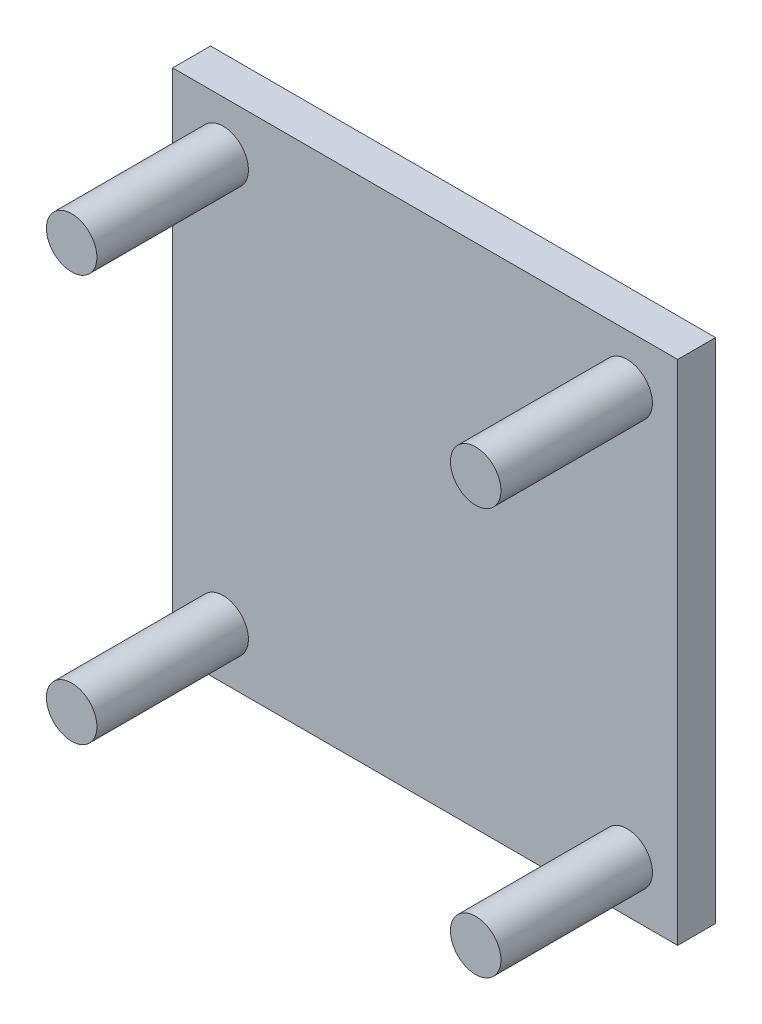
ISO-10303-21;
HEADER;
FILE_DESCRIPTION(('STEP AP214'),'2;1');
FILE_NAME('part.step','',(''),(''),'','','');
FILE_SCHEMA(('AUTOMOTIVE_DESIGN { 1 0 10303 214 1 1 1 1 }'));
ENDSEC;
DATA;
#1=APPLICATION_CONTEXT('core data for automotive mechanical design processes');
#2=APPLICATION_PROTOCOL_DEFINITION('international standard','automotive_design',2000,#1);
#3=PRODUCT_CONTEXT('',#1,'mechanical');
#4=PRODUCT('Part','Part','',(#3));
#5=PRODUCT_RELATED_PRODUCT_CATEGORY('part','',(#4));
#6=PRODUCT_DEFINITION_FORMATION('','',#4);
#7=PRODUCT_DEFINITION_CONTEXT('part definition',#1,'design');
#8=PRODUCT_DEFINITION('design','',#6,#7);
#9=PRODUCT_DEFINITION_SHAPE('','',#8);
#10=(LENGTH_UNIT() NAMED_UNIT(*) SI_UNIT(.MILLI.,.METRE.));
#11=(NAMED_UNIT(*) PLANE_ANGLE_UNIT() SI_UNIT($,.RADIAN.));
#12=(NAMED_UNIT(*) SI_UNIT($,.STERADIAN.) SOLID_ANGLE_UNIT());
#13=UNCERTAINTY_MEASURE_WITH_UNIT(LENGTH_MEASURE(1.E-05),#10,'distance_accuracy_value','');
#14=(GEOMETRIC_REPRESENTATION_CONTEXT(3) GLOBAL_UNCERTAINTY_ASSIGNED_CONTEXT((#13)) GLOBAL_UNIT_ASSIGNED_CONTEXT((#10,
#11,#12)) REPRESENTATION_CONTEXT('',''));
#15=CARTESIAN_POINT('',(0.,0.,0.));
#16=DIRECTION('',(0.,0.,1.));
#17=DIRECTION('',(1.,0.,0.));
#18=AXIS2_PLACEMENT_3D('',#15,#16,#17);
#19=CARTESIAN_POINT('',(-20.,20.0966993778737,3.));
#20=DIRECTION('',(1.,0.,0.));
#21=DIRECTION('',(0.,0.,-1.));
#22=AXIS2_PLACEMENT_3D('',#19,#20,#21);
#23=PLANE('',#22);
#24=DIRECTION('',(0.,-1.,0.));
#25=VECTOR('',#24,1.);
#26=CARTESIAN_POINT('',(-20.,20.0966993778737,0.));
#27=LINE('',#26,#25);
#28=CARTESIAN_POINT('',(-20.,20.0966993778737,0.));
#29=VERTEX_POINT('',#28);
#30=CARTESIAN_POINT('',(-20.,-20.0966993778737,0.));
#31=VERTEX_POINT('',#30);
#32=EDGE_CURVE('E100',#29,#31,#27,.T.);
#33=ORIENTED_EDGE('',*,*,#32,.T.);
#34=DIRECTION('',(0.,0.,-1.));
#35=VECTOR('',#34,1.);
#36=CARTESIAN_POINT('',(-20.,-20.0966993778737,3.));
#37=LINE('',#36,#35);
#38=CARTESIAN_POINT('',(-20.,-20.0966993778737,3.));
#39=VERTEX_POINT('',#38);
#40=EDGE_CURVE('E11',#39,#31,#37,.T.);
#41=ORIENTED_EDGE('',*,*,#40,.F.);
#42=DIRECTION('',(0.,-1.,0.));
#43=VECTOR('',#42,1.);
#44=CARTESIAN_POINT('',(-20.,20.0966993778737,3.));
#45=LINE('',#44,#43);
#46=CARTESIAN_POINT('',(-20.,20.0966993778737,3.));
#47=VERTEX_POINT('',#46);
#48=EDGE_CURVE('E88',#47,#39,#45,.T.);
#49=ORIENTED_EDGE('',*,*,#48,.F.);
#50=DIRECTION('',(0.,0.,-1.));
#51=VECTOR('',#50,1.);
#52=CARTESIAN_POINT('',(-20.,20.0966993778737,3.));
#53=LINE('',#52,#51);
#54=EDGE_CURVE('E96',#47,#29,#53,.T.);
#55=ORIENTED_EDGE('',*,*,#54,.T.);
#56=EDGE_LOOP('',(#33,#41,#49,#55));
#57=FACE_BOUND('',#56,.T.);
#58=ADVANCED_FACE('F37',(#57),#23,.F.);
#59=CARTESIAN_POINT('',(-20.,-20.0966993778737,3.));
#60=DIRECTION('',(0.,1.,0.));
#61=DIRECTION('',(0.,0.,1.));
#62=AXIS2_PLACEMENT_3D('',#59,#60,#61);
#63=PLANE('',#62);
#64=DIRECTION('',(1.,0.,0.));
#65=VECTOR('',#64,1.);
#66=CARTESIAN_POINT('',(-20.,-20.0966993778737,0.));
#67=LINE('',#66,#65);
#68=CARTESIAN_POINT('',(20.,-20.0966993778737,0.));
#69=VERTEX_POINT('',#68);
#70=EDGE_CURVE('E92',#31,#69,#67,.T.);
#71=ORIENTED_EDGE('',*,*,#70,.T.);
#72=DIRECTION('',(0.,0.,-1.));
#73=VECTOR('',#72,1.);
#74=CARTESIAN_POINT('',(20.,-20.0966993778737,3.));
#75=LINE('',#74,#73);
#76=CARTESIAN_POINT('',(20.,-20.0966993778737,3.));
#77=VERTEX_POINT('',#76);
#78=EDGE_CURVE('E45',#77,#69,#75,.T.);
#79=ORIENTED_EDGE('',*,*,#78,.F.);
#80=DIRECTION('',(1.,0.,0.));
#81=VECTOR('',#80,1.);
#82=CARTESIAN_POINT('',(-20.,-20.0966993778737,3.));
#83=LINE('',#82,#81);
#84=EDGE_CURVE('E83',#39,#77,#83,.T.);
#85=ORIENTED_EDGE('',*,*,#84,.F.);
#86=ORIENTED_EDGE('',*,*,#40,.T.);
#87=EDGE_LOOP('',(#71,#79,#85,#86));
#88=FACE_BOUND('',#87,.T.);
#89=ADVANCED_FACE('F91',(#88),#63,.F.);
#90=CARTESIAN_POINT('',(20.,-20.0966993778737,3.));
#91=DIRECTION('',(-1.,0.,0.));
#92=DIRECTION('',(0.,0.,1.));
#93=AXIS2_PLACEMENT_3D('',#90,#91,#92);
#94=PLANE('',#93);
#95=DIRECTION('',(0.,1.,0.));
#96=VECTOR('',#95,1.);
#97=CARTESIAN_POINT('',(20.,-20.0966993778737,0.));
#98=LINE('',#97,#96);
#99=CARTESIAN_POINT('',(20.,20.0966993778737,0.));
#100=VERTEX_POINT('',#99);
#101=EDGE_CURVE('E70',#69,#100,#98,.T.);
#102=ORIENTED_EDGE('',*,*,#101,.T.);
#103=DIRECTION('',(0.,0.,-1.));
#104=VECTOR('',#103,1.);
#105=CARTESIAN_POINT('',(20.,20.0966993778737,3.));
#106=LINE('',#105,#104);
#107=CARTESIAN_POINT('',(20.,20.0966993778737,3.));
#108=VERTEX_POINT('',#107);
#109=EDGE_CURVE('E93',#108,#100,#106,.T.);
#110=ORIENTED_EDGE('',*,*,#109,.F.);
#111=DIRECTION('',(0.,1.,0.));
#112=VECTOR('',#111,1.);
#113=CARTESIAN_POINT('',(20.,-20.0966993778737,3.));
#114=LINE('',#113,#112);
#115=EDGE_CURVE('E86',#77,#108,#114,.T.);
#116=ORIENTED_EDGE('',*,*,#115,.F.);
#117=ORIENTED_EDGE('',*,*,#78,.T.);
#118=EDGE_LOOP('',(#102,#110,#116,#117));
#119=FACE_BOUND('',#118,.T.);
#120=ADVANCED_FACE('F94',(#119),#94,.F.);
#121=CARTESIAN_POINT('',(20.,20.0966993778737,3.));
#122=DIRECTION('',(0.,-1.,0.));
#123=DIRECTION('',(0.,0.,-1.));
#124=AXIS2_PLACEMENT_3D('',#121,#122,#123);
#125=PLANE('',#124);
#126=DIRECTION('',(-1.,0.,0.));
#127=VECTOR('',#126,1.);
#128=CARTESIAN_POINT('',(20.,20.0966993778737,0.));
#129=LINE('',#128,#127);
#130=EDGE_CURVE('E76',#100,#29,#129,.T.);
#131=ORIENTED_EDGE('',*,*,#130,.T.);
#132=ORIENTED_EDGE('',*,*,#54,.F.);
#133=DIRECTION('',(-1.,0.,0.));
#134=VECTOR('',#133,1.);
#135=CARTESIAN_POINT('',(20.,20.0966993778737,3.));
#136=LINE('',#135,#134);
#137=EDGE_CURVE('E53',#108,#47,#136,.T.);
#138=ORIENTED_EDGE('',*,*,#137,.F.);
#139=ORIENTED_EDGE('',*,*,#109,.T.);
#140=EDGE_LOOP('',(#131,#132,#138,#139));
#141=FACE_BOUND('',#140,.T.);
#142=ADVANCED_FACE('F108',(#141),#125,.F.);
#143=CARTESIAN_POINT('',(0.,0.,3.));
#144=DIRECTION('',(0.,0.,1.));
#145=DIRECTION('',(1.,0.,0.));
#146=AXIS2_PLACEMENT_3D('',#143,#144,#145);
#147=PLANE('',#146);
#148=CARTESIAN_POINT('',(16.,16.0966993778737,3.));
#149=DIRECTION('',(0.,0.,1.));
#150=DIRECTION('',(1.,0.,0.));
#151=AXIS2_PLACEMENT_3D('',#148,#149,#150);
#152=CIRCLE('',#151,2.);
#153=CARTESIAN_POINT('',(18.,16.0966993778737,3.));
#154=VERTEX_POINT('',#153);
#155=EDGE_CURVE('E132',#154,#154,#152,.T.);
#156=ORIENTED_EDGE('',*,*,#155,.F.);
#157=EDGE_LOOP('',(#156));
#158=FACE_BOUND('',#157,.T.);
#159=CARTESIAN_POINT('',(16.,-16.0966993778737,3.));
#160=DIRECTION('',(0.,0.,1.));
#161=DIRECTION('',(1.,0.,0.));
#162=AXIS2_PLACEMENT_3D('',#159,#160,#161);
#163=CIRCLE('',#162,2.);
#164=CARTESIAN_POINT('',(18.,-16.0966993778737,3.));
#165=VERTEX_POINT('',#164);
#166=EDGE_CURVE('E126',#165,#165,#163,.T.);
#167=ORIENTED_EDGE('',*,*,#166,.F.);
#168=EDGE_LOOP('',(#167));
#169=FACE_BOUND('',#168,.T.);
#170=CARTESIAN_POINT('',(-16.,16.0966993778737,3.));
#171=DIRECTION('',(0.,0.,1.));
#172=DIRECTION('',(1.,0.,0.));
#173=AXIS2_PLACEMENT_3D('',#170,#171,#172);
#174=CIRCLE('',#173,2.);
#175=CARTESIAN_POINT('',(-14.,16.0966993778737,3.));
#176=VERTEX_POINT('',#175);
#177=EDGE_CURVE('E120',#176,#176,#174,.T.);
#178=ORIENTED_EDGE('',*,*,#177,.F.);
#179=EDGE_LOOP('',(#178));
#180=FACE_BOUND('',#179,.T.);
#181=CARTESIAN_POINT('',(-16.,-16.0966993778737,3.));
#182=DIRECTION('',(0.,0.,1.));
#183=DIRECTION('',(1.,0.,0.));
#184=AXIS2_PLACEMENT_3D('',#181,#182,#183);
#185=CIRCLE('',#184,2.);
#186=CARTESIAN_POINT('',(-14.,-16.0966993778737,3.));
#187=VERTEX_POINT('',#186);
#188=EDGE_CURVE('E114',#187,#187,#185,.T.);
#189=ORIENTED_EDGE('',*,*,#188,.F.);
#190=EDGE_LOOP('',(#189));
#191=FACE_BOUND('',#190,.T.);
#192=ORIENTED_EDGE('',*,*,#48,.T.);
#193=ORIENTED_EDGE('',*,*,#84,.T.);
#194=ORIENTED_EDGE('',*,*,#115,.T.);
#195=ORIENTED_EDGE('',*,*,#137,.T.);
#196=EDGE_LOOP('',(#192,#193,#194,#195));
#197=FACE_BOUND('',#196,.T.);
#198=ADVANCED_FACE('F84',(#158,#169,#180,#191,#197),#147,.T.);
#199=CARTESIAN_POINT('',(0.,0.,0.));
#200=DIRECTION('',(0.,0.,1.));
#201=DIRECTION('',(1.,0.,0.));
#202=AXIS2_PLACEMENT_3D('',#199,#200,#201);
#203=PLANE('',#202);
#204=ORIENTED_EDGE('',*,*,#32,.F.);
#205=ORIENTED_EDGE('',*,*,#130,.F.);
#206=ORIENTED_EDGE('',*,*,#101,.F.);
#207=ORIENTED_EDGE('',*,*,#70,.F.);
#208=EDGE_LOOP('',(#204,#205,#206,#207));
#209=FACE_BOUND('',#208,.T.);
#210=ADVANCED_FACE('F111',(#209),#203,.F.);
#211=CARTESIAN_POINT('',(-16.,-16.0966993778737,15.));
#212=DIRECTION('',(0.,0.,-1.));
#213=DIRECTION('',(-1.,0.,0.));
#214=AXIS2_PLACEMENT_3D('',#211,#212,#213);
#215=CYLINDRICAL_SURFACE('',#214,2.);
#216=CARTESIAN_POINT('',(-16.,-16.0966993778737,15.));
#217=DIRECTION('',(0.,0.,1.));
#218=DIRECTION('',(1.,0.,0.));
#219=AXIS2_PLACEMENT_3D('',#216,#217,#218);
#220=CIRCLE('',#219,2.);
#221=CARTESIAN_POINT('',(-14.,-16.0966993778737,15.));
#222=VERTEX_POINT('',#221);
#223=EDGE_CURVE('E103',#222,#222,#220,.T.);
#224=ORIENTED_EDGE('',*,*,#223,.F.);
#225=EDGE_LOOP('',(#224));
#226=FACE_BOUND('',#225,.T.);
#227=ORIENTED_EDGE('',*,*,#188,.T.);
#228=EDGE_LOOP('',(#227));
#229=FACE_BOUND('',#228,.T.);
#230=ADVANCED_FACE('F156',(#226,#229),#215,.T.);
#231=CARTESIAN_POINT('',(-16.,-16.0966993778737,15.));
#232=DIRECTION('',(0.,0.,1.));
#233=DIRECTION('',(1.,0.,0.));
#234=AXIS2_PLACEMENT_3D('',#231,#232,#233);
#235=PLANE('',#234);
#236=ORIENTED_EDGE('',*,*,#223,.T.);
#237=EDGE_LOOP('',(#236));
#238=FACE_BOUND('',#237,.T.);
#239=ADVANCED_FACE('F158',(#238),#235,.T.);
#240=CARTESIAN_POINT('',(-16.,16.0966993778737,15.));
#241=DIRECTION('',(0.,0.,-1.));
#242=DIRECTION('',(-1.,0.,0.));
#243=AXIS2_PLACEMENT_3D('',#240,#241,#242);
#244=CYLINDRICAL_SURFACE('',#243,2.);
#245=CARTESIAN_POINT('',(-16.,16.0966993778737,15.));
#246=DIRECTION('',(0.,0.,1.));
#247=DIRECTION('',(1.,0.,0.));
#248=AXIS2_PLACEMENT_3D('',#245,#246,#247);
#249=CIRCLE('',#248,2.);
#250=CARTESIAN_POINT('',(-14.,16.0966993778737,15.));
#251=VERTEX_POINT('',#250);
#252=EDGE_CURVE('E117',#251,#251,#249,.T.);
#253=ORIENTED_EDGE('',*,*,#252,.F.);
#254=EDGE_LOOP('',(#253));
#255=FACE_BOUND('',#254,.T.);
#256=ORIENTED_EDGE('',*,*,#177,.T.);
#257=EDGE_LOOP('',(#256));
#258=FACE_BOUND('',#257,.T.);
#259=ADVANCED_FACE('F165',(#255,#258),#244,.T.);
#260=CARTESIAN_POINT('',(-16.,16.0966993778737,15.));
#261=DIRECTION('',(0.,0.,1.));
#262=DIRECTION('',(1.,0.,0.));
#263=AXIS2_PLACEMENT_3D('',#260,#261,#262);
#264=PLANE('',#263);
#265=ORIENTED_EDGE('',*,*,#252,.T.);
#266=EDGE_LOOP('',(#265));
#267=FACE_BOUND('',#266,.T.);
#268=ADVANCED_FACE('F213',(#267),#264,.T.);
#269=CARTESIAN_POINT('',(16.,-16.0966993778737,15.));
#270=DIRECTION('',(0.,0.,-1.));
#271=DIRECTION('',(-1.,0.,0.));
#272=AXIS2_PLACEMENT_3D('',#269,#270,#271);
#273=CYLINDRICAL_SURFACE('',#272,2.);
#274=CARTESIAN_POINT('',(16.,-16.0966993778737,15.));
#275=DIRECTION('',(0.,0.,1.));
#276=DIRECTION('',(1.,0.,0.));
#277=AXIS2_PLACEMENT_3D('',#274,#275,#276);
#278=CIRCLE('',#277,2.);
#279=CARTESIAN_POINT('',(18.,-16.0966993778737,15.));
#280=VERTEX_POINT('',#279);
#281=EDGE_CURVE('E123',#280,#280,#278,.T.);
#282=ORIENTED_EDGE('',*,*,#281,.F.);
#283=EDGE_LOOP('',(#282));
#284=FACE_BOUND('',#283,.T.);
#285=ORIENTED_EDGE('',*,*,#166,.T.);
#286=EDGE_LOOP('',(#285));
#287=FACE_BOUND('',#286,.T.);
#288=ADVANCED_FACE('F222',(#284,#287),#273,.T.);
#289=CARTESIAN_POINT('',(16.,-16.0966993778737,15.));
#290=DIRECTION('',(0.,0.,1.));
#291=DIRECTION('',(1.,0.,0.));
#292=AXIS2_PLACEMENT_3D('',#289,#290,#291);
#293=PLANE('',#292);
#294=ORIENTED_EDGE('',*,*,#281,.T.);
#295=EDGE_LOOP('',(#294));
#296=FACE_BOUND('',#295,.T.);
#297=ADVANCED_FACE('F143',(#296),#293,.T.);
#298=CARTESIAN_POINT('',(16.,16.0966993778737,15.));
#299=DIRECTION('',(0.,0.,-1.));
#300=DIRECTION('',(-1.,0.,0.));
#301=AXIS2_PLACEMENT_3D('',#298,#299,#300);
#302=CYLINDRICAL_SURFACE('',#301,2.);
#303=CARTESIAN_POINT('',(16.,16.0966993778737,15.));
#304=DIRECTION('',(0.,0.,1.));
#305=DIRECTION('',(1.,0.,0.));
#306=AXIS2_PLACEMENT_3D('',#303,#304,#305);
#307=CIRCLE('',#306,2.);
#308=CARTESIAN_POINT('',(18.,16.0966993778737,15.));
#309=VERTEX_POINT('',#308);
#310=EDGE_CURVE('E129',#309,#309,#307,.T.);
#311=ORIENTED_EDGE('',*,*,#310,.F.);
#312=EDGE_LOOP('',(#311));
#313=FACE_BOUND('',#312,.T.);
#314=ORIENTED_EDGE('',*,*,#155,.T.);
#315=EDGE_LOOP('',(#314));
#316=FACE_BOUND('',#315,.T.);
#317=ADVANCED_FACE('F140',(#313,#316),#302,.T.);
#318=CARTESIAN_POINT('',(16.,16.0966993778737,15.));
#319=DIRECTION('',(0.,0.,1.));
#320=DIRECTION('',(1.,0.,0.));
#321=AXIS2_PLACEMENT_3D('',#318,#319,#320);
#322=PLANE('',#321);
#323=ORIENTED_EDGE('',*,*,#310,.T.);
#324=EDGE_LOOP('',(#323));
#325=FACE_BOUND('',#324,.T.);
#326=ADVANCED_FACE('F138',(#325),#322,.T.);
#327=CLOSED_SHELL('',(#58,#89,#120,#142,#198,#210,#230,#239,#259,#268,#288,#297,#317,#326));
#328=MANIFOLD_SOLID_BREP('B2',#327);
#329=ADVANCED_BREP_SHAPE_REPRESENTATION('',(#18,#328),#14);
#330=SHAPE_DEFINITION_REPRESENTATION(#9,#329);
ENDSEC;
END-ISO-10303-21;
